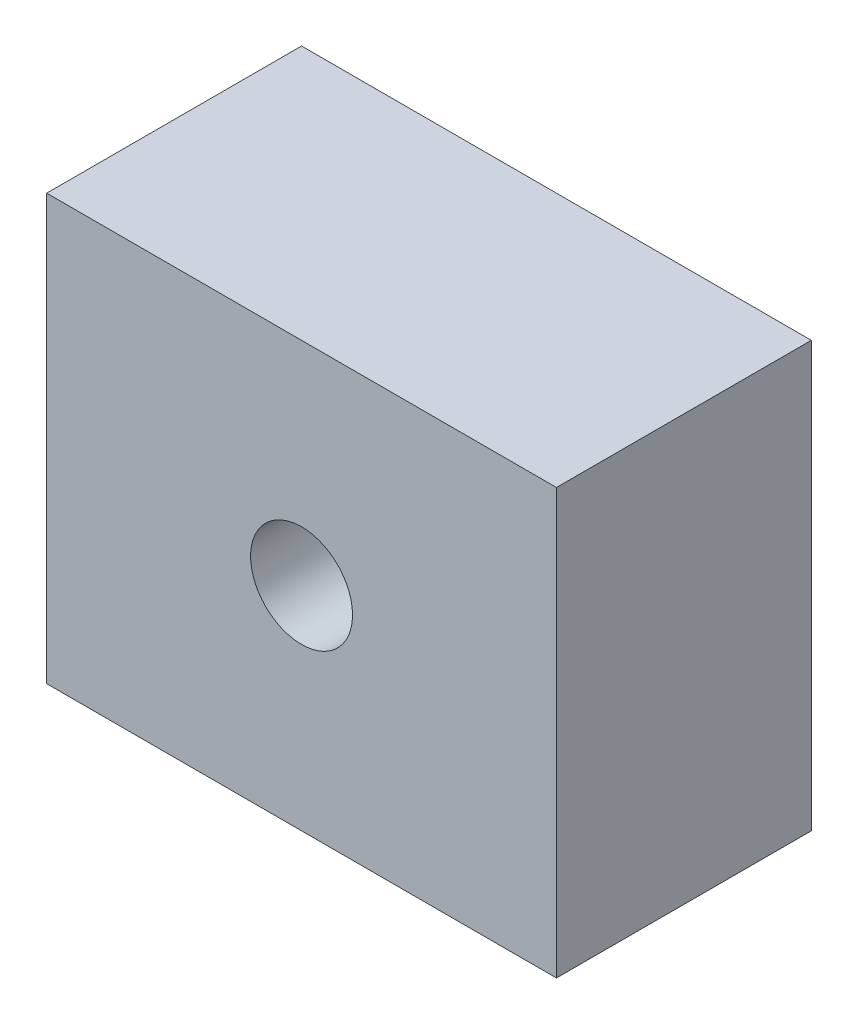
ISO-10303-21;
HEADER;
FILE_DESCRIPTION(('STEP AP214'),'2;1');
FILE_NAME('part.step','',(''),(''),'','','');
FILE_SCHEMA(('AUTOMOTIVE_DESIGN { 1 0 10303 214 1 1 1 1 }'));
ENDSEC;
DATA;
#1=APPLICATION_CONTEXT('core data for automotive mechanical design processes');
#2=APPLICATION_PROTOCOL_DEFINITION('international standard','automotive_design',2000,#1);
#3=PRODUCT_CONTEXT('',#1,'mechanical');
#4=PRODUCT('Part','Part','',(#3));
#5=PRODUCT_RELATED_PRODUCT_CATEGORY('part','',(#4));
#6=PRODUCT_DEFINITION_FORMATION('','',#4);
#7=PRODUCT_DEFINITION_CONTEXT('part definition',#1,'design');
#8=PRODUCT_DEFINITION('design','',#6,#7);
#9=PRODUCT_DEFINITION_SHAPE('','',#8);
#10=(LENGTH_UNIT() NAMED_UNIT(*) SI_UNIT(.MILLI.,.METRE.));
#11=(NAMED_UNIT(*) PLANE_ANGLE_UNIT() SI_UNIT($,.RADIAN.));
#12=(NAMED_UNIT(*) SI_UNIT($,.STERADIAN.) SOLID_ANGLE_UNIT());
#13=UNCERTAINTY_MEASURE_WITH_UNIT(LENGTH_MEASURE(1.E-05),#10,'distance_accuracy_value','');
#14=(GEOMETRIC_REPRESENTATION_CONTEXT(3) GLOBAL_UNCERTAINTY_ASSIGNED_CONTEXT((#13)) GLOBAL_UNIT_ASSIGNED_CONTEXT((#10,
#11,#12)) REPRESENTATION_CONTEXT('',''));
#15=CARTESIAN_POINT('',(0.,0.,0.));
#16=DIRECTION('',(0.,0.,1.));
#17=DIRECTION('',(1.,0.,0.));
#18=AXIS2_PLACEMENT_3D('',#15,#16,#17);
#19=CARTESIAN_POINT('',(0.,0.,0.));
#20=DIRECTION('',(0.,0.,1.));
#21=DIRECTION('',(1.,0.,0.));
#22=AXIS2_PLACEMENT_3D('',#19,#20,#21);
#23=PLANE('',#22);
#24=CARTESIAN_POINT('',(0.,0.,0.));
#25=DIRECTION('',(0.,0.,1.));
#26=DIRECTION('',(1.,0.,0.));
#27=AXIS2_PLACEMENT_3D('',#24,#25,#26);
#28=CIRCLE('',#27,3.);
#29=CARTESIAN_POINT('',(3.,0.,0.));
#30=VERTEX_POINT('',#29);
#31=EDGE_CURVE('E20',#30,#30,#28,.T.);
#32=ORIENTED_EDGE('',*,*,#31,.T.);
#33=EDGE_LOOP('',(#32));
#34=FACE_BOUND('',#33,.T.);
#35=DIRECTION('',(0.,1.,0.));
#36=VECTOR('',#35,1.);
#37=CARTESIAN_POINT('',(15.,12.5,0.));
#38=LINE('',#37,#36);
#39=CARTESIAN_POINT('',(15.,-12.5,0.));
#40=VERTEX_POINT('',#39);
#41=CARTESIAN_POINT('',(15.,12.5,0.));
#42=VERTEX_POINT('',#41);
#43=EDGE_CURVE('E59',#40,#42,#38,.T.);
#44=ORIENTED_EDGE('',*,*,#43,.F.);
#45=DIRECTION('',(1.,0.,0.));
#46=VECTOR('',#45,1.);
#47=CARTESIAN_POINT('',(15.,-12.5,0.));
#48=LINE('',#47,#46);
#49=CARTESIAN_POINT('',(-15.,-12.5,0.));
#50=VERTEX_POINT('',#49);
#51=EDGE_CURVE('E82',#50,#40,#48,.T.);
#52=ORIENTED_EDGE('',*,*,#51,.F.);
#53=DIRECTION('',(0.,1.,0.));
#54=VECTOR('',#53,1.);
#55=CARTESIAN_POINT('',(-15.,-12.5,0.));
#56=LINE('',#55,#54);
#57=CARTESIAN_POINT('',(-15.,12.5,0.));
#58=VERTEX_POINT('',#57);
#59=EDGE_CURVE('E69',#58,#50,#56,.F.);
#60=ORIENTED_EDGE('',*,*,#59,.F.);
#61=DIRECTION('',(1.,0.,0.));
#62=VECTOR('',#61,1.);
#63=CARTESIAN_POINT('',(-15.,12.5,0.));
#64=LINE('',#63,#62);
#65=EDGE_CURVE('E54',#42,#58,#64,.F.);
#66=ORIENTED_EDGE('',*,*,#65,.F.);
#67=EDGE_LOOP('',(#44,#52,#60,#66));
#68=FACE_BOUND('',#67,.T.);
#69=ADVANCED_FACE('F17',(#34,#68),#23,.F.);
#70=CARTESIAN_POINT('',(15.,12.5,0.));
#71=DIRECTION('',(1.,0.,0.));
#72=DIRECTION('',(0.,0.,-1.));
#73=AXIS2_PLACEMENT_3D('',#70,#71,#72);
#74=PLANE('',#73);
#75=ORIENTED_EDGE('',*,*,#43,.T.);
#76=DIRECTION('',(0.,0.,1.));
#77=VECTOR('',#76,1.);
#78=CARTESIAN_POINT('',(15.,12.5,0.));
#79=LINE('',#78,#77);
#80=CARTESIAN_POINT('',(15.,12.5,15.));
#81=VERTEX_POINT('',#80);
#82=EDGE_CURVE('E61',#81,#42,#79,.F.);
#83=ORIENTED_EDGE('',*,*,#82,.F.);
#84=DIRECTION('',(0.,1.,0.));
#85=VECTOR('',#84,1.);
#86=CARTESIAN_POINT('',(15.,0.,15.));
#87=LINE('',#86,#85);
#88=CARTESIAN_POINT('',(15.,-12.5,15.));
#89=VERTEX_POINT('',#88);
#90=EDGE_CURVE('E85',#89,#81,#87,.T.);
#91=ORIENTED_EDGE('',*,*,#90,.F.);
#92=DIRECTION('',(0.,0.,-1.));
#93=VECTOR('',#92,1.);
#94=CARTESIAN_POINT('',(15.,-12.5,0.));
#95=LINE('',#94,#93);
#96=EDGE_CURVE('E64',#40,#89,#95,.F.);
#97=ORIENTED_EDGE('',*,*,#96,.F.);
#98=EDGE_LOOP('',(#75,#83,#91,#97));
#99=FACE_BOUND('',#98,.T.);
#100=ADVANCED_FACE('F60',(#99),#74,.T.);
#101=CARTESIAN_POINT('',(-15.,12.5,0.));
#102=DIRECTION('',(0.,1.,0.));
#103=DIRECTION('',(0.,0.,1.));
#104=AXIS2_PLACEMENT_3D('',#101,#102,#103);
#105=PLANE('',#104);
#106=ORIENTED_EDGE('',*,*,#65,.T.);
#107=DIRECTION('',(0.,0.,1.));
#108=VECTOR('',#107,1.);
#109=CARTESIAN_POINT('',(-15.,12.5,0.));
#110=LINE('',#109,#108);
#111=CARTESIAN_POINT('',(-15.,12.5,15.));
#112=VERTEX_POINT('',#111);
#113=EDGE_CURVE('E71',#112,#58,#110,.F.);
#114=ORIENTED_EDGE('',*,*,#113,.F.);
#115=DIRECTION('',(1.,0.,0.));
#116=VECTOR('',#115,1.);
#117=CARTESIAN_POINT('',(0.,12.5,15.));
#118=LINE('',#117,#116);
#119=EDGE_CURVE('E75',#81,#112,#118,.F.);
#120=ORIENTED_EDGE('',*,*,#119,.F.);
#121=ORIENTED_EDGE('',*,*,#82,.T.);
#122=EDGE_LOOP('',(#106,#114,#120,#121));
#123=FACE_BOUND('',#122,.T.);
#124=ADVANCED_FACE('F73',(#123),#105,.T.);
#125=CARTESIAN_POINT('',(-15.,-12.5,0.));
#126=DIRECTION('',(-1.,0.,0.));
#127=DIRECTION('',(0.,0.,1.));
#128=AXIS2_PLACEMENT_3D('',#125,#126,#127);
#129=PLANE('',#128);
#130=ORIENTED_EDGE('',*,*,#59,.T.);
#131=DIRECTION('',(0.,0.,-1.));
#132=VECTOR('',#131,1.);
#133=CARTESIAN_POINT('',(-15.,-12.5,0.));
#134=LINE('',#133,#132);
#135=CARTESIAN_POINT('',(-15.,-12.5,15.));
#136=VERTEX_POINT('',#135);
#137=EDGE_CURVE('E34',#136,#50,#134,.T.);
#138=ORIENTED_EDGE('',*,*,#137,.F.);
#139=DIRECTION('',(0.,1.,0.));
#140=VECTOR('',#139,1.);
#141=CARTESIAN_POINT('',(-15.,0.,15.));
#142=LINE('',#141,#140);
#143=EDGE_CURVE('E88',#112,#136,#142,.F.);
#144=ORIENTED_EDGE('',*,*,#143,.F.);
#145=ORIENTED_EDGE('',*,*,#113,.T.);
#146=EDGE_LOOP('',(#130,#138,#144,#145));
#147=FACE_BOUND('',#146,.T.);
#148=ADVANCED_FACE('F98',(#147),#129,.T.);
#149=CARTESIAN_POINT('',(15.,-12.5,0.));
#150=DIRECTION('',(0.,-1.,0.));
#151=DIRECTION('',(0.,0.,-1.));
#152=AXIS2_PLACEMENT_3D('',#149,#150,#151);
#153=PLANE('',#152);
#154=ORIENTED_EDGE('',*,*,#51,.T.);
#155=ORIENTED_EDGE('',*,*,#96,.T.);
#156=DIRECTION('',(1.,0.,0.));
#157=VECTOR('',#156,1.);
#158=CARTESIAN_POINT('',(0.,-12.5,15.));
#159=LINE('',#158,#157);
#160=EDGE_CURVE('E26',#136,#89,#159,.T.);
#161=ORIENTED_EDGE('',*,*,#160,.F.);
#162=ORIENTED_EDGE('',*,*,#137,.T.);
#163=EDGE_LOOP('',(#154,#155,#161,#162));
#164=FACE_BOUND('',#163,.T.);
#165=ADVANCED_FACE('F95',(#164),#153,.T.);
#166=CARTESIAN_POINT('',(0.,0.,0.));
#167=DIRECTION('',(0.,0.,1.));
#168=DIRECTION('',(1.,0.,0.));
#169=AXIS2_PLACEMENT_3D('',#166,#167,#168);
#170=CYLINDRICAL_SURFACE('',#169,3.);
#171=ORIENTED_EDGE('',*,*,#31,.F.);
#172=EDGE_LOOP('',(#171));
#173=FACE_BOUND('',#172,.T.);
#174=CARTESIAN_POINT('',(0.,0.,15.));
#175=DIRECTION('',(0.,0.,1.));
#176=DIRECTION('',(1.,0.,0.));
#177=AXIS2_PLACEMENT_3D('',#174,#175,#176);
#178=CIRCLE('',#177,3.);
#179=CARTESIAN_POINT('',(3.,0.,15.));
#180=VERTEX_POINT('',#179);
#181=EDGE_CURVE('E11',#180,#180,#178,.F.);
#182=ORIENTED_EDGE('',*,*,#181,.F.);
#183=EDGE_LOOP('',(#182));
#184=FACE_BOUND('',#183,.T.);
#185=ADVANCED_FACE('F97',(#173,#184),#170,.F.);
#186=CARTESIAN_POINT('',(0.,0.,15.));
#187=DIRECTION('',(0.,0.,1.));
#188=DIRECTION('',(1.,0.,0.));
#189=AXIS2_PLACEMENT_3D('',#186,#187,#188);
#190=PLANE('',#189);
#191=ORIENTED_EDGE('',*,*,#181,.T.);
#192=EDGE_LOOP('',(#191));
#193=FACE_BOUND('',#192,.T.);
#194=ORIENTED_EDGE('',*,*,#143,.T.);
#195=ORIENTED_EDGE('',*,*,#160,.T.);
#196=ORIENTED_EDGE('',*,*,#90,.T.);
#197=ORIENTED_EDGE('',*,*,#119,.T.);
#198=EDGE_LOOP('',(#194,#195,#196,#197));
#199=FACE_BOUND('',#198,.T.);
#200=ADVANCED_FACE('F93',(#193,#199),#190,.T.);
#201=CLOSED_SHELL('',(#69,#100,#124,#148,#165,#185,#200));
#202=MANIFOLD_SOLID_BREP('B1',#201);
#203=ADVANCED_BREP_SHAPE_REPRESENTATION('',(#18,#202),#14);
#204=SHAPE_DEFINITION_REPRESENTATION(#9,#203);
ENDSEC;
END-ISO-10303-21;
